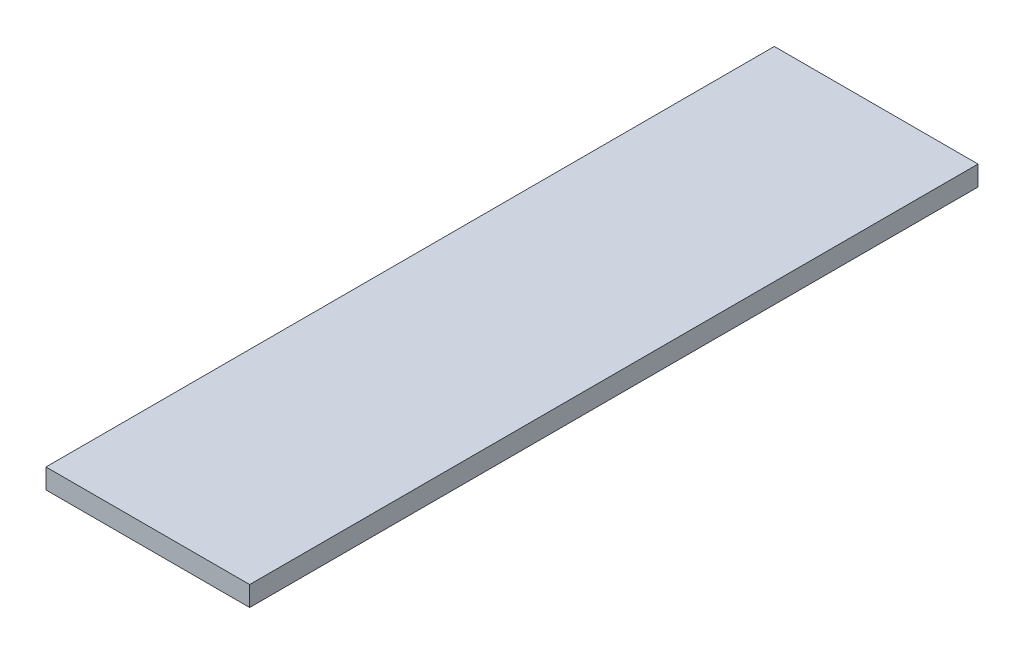
ISO-10303-21;
HEADER;
FILE_DESCRIPTION(('STEP AP214'),'2;1');
FILE_NAME('part.step','',(''),(''),'','','');
FILE_SCHEMA(('AUTOMOTIVE_DESIGN { 1 0 10303 214 1 1 1 1 }'));
ENDSEC;
DATA;
#1=APPLICATION_CONTEXT('core data for automotive mechanical design processes');
#2=APPLICATION_PROTOCOL_DEFINITION('international standard','automotive_design',2000,#1);
#3=PRODUCT_CONTEXT('',#1,'mechanical');
#4=PRODUCT('Part','Part','',(#3));
#5=PRODUCT_RELATED_PRODUCT_CATEGORY('part','',(#4));
#6=PRODUCT_DEFINITION_FORMATION('','',#4);
#7=PRODUCT_DEFINITION_CONTEXT('part definition',#1,'design');
#8=PRODUCT_DEFINITION('design','',#6,#7);
#9=PRODUCT_DEFINITION_SHAPE('','',#8);
#10=(LENGTH_UNIT() NAMED_UNIT(*) SI_UNIT(.MILLI.,.METRE.));
#11=(NAMED_UNIT(*) PLANE_ANGLE_UNIT() SI_UNIT($,.RADIAN.));
#12=(NAMED_UNIT(*) SI_UNIT($,.STERADIAN.) SOLID_ANGLE_UNIT());
#13=UNCERTAINTY_MEASURE_WITH_UNIT(LENGTH_MEASURE(1.E-05),#10,'distance_accuracy_value','');
#14=(GEOMETRIC_REPRESENTATION_CONTEXT(3) GLOBAL_UNCERTAINTY_ASSIGNED_CONTEXT((#13)) GLOBAL_UNIT_ASSIGNED_CONTEXT((#10,
#11,#12)) REPRESENTATION_CONTEXT('',''));
#15=CARTESIAN_POINT('',(0.,0.,0.));
#16=DIRECTION('',(0.,0.,1.));
#17=DIRECTION('',(1.,0.,0.));
#18=AXIS2_PLACEMENT_3D('',#15,#16,#17);
#19=CARTESIAN_POINT('',(-4.99999999999994,-1039.94000000006,-842.878338374161));
#20=DIRECTION('',(1.,0.,0.));
#21=DIRECTION('',(0.,1.,0.));
#22=AXIS2_PLACEMENT_3D('',#19,#20,#21);
#23=PLANE('',#22);
#24=DIRECTION('',(0.,-1.,0.));
#25=VECTOR('',#24,1.);
#26=CARTESIAN_POINT('',(-4.99999999999994,-1039.94000000006,-657.999999999975));
#27=LINE('',#26,#25);
#28=CARTESIAN_POINT('',(-4.99999999999994,-1021.94000000006,-657.999999999975));
#29=VERTEX_POINT('',#28);
#30=CARTESIAN_POINT('',(-4.99999999999994,-1039.94000000006,-657.999999999975));
#31=VERTEX_POINT('',#30);
#32=EDGE_CURVE('E96',#29,#31,#27,.T.);
#33=ORIENTED_EDGE('',*,*,#32,.F.);
#34=DIRECTION('',(0.,0.,1.));
#35=VECTOR('',#34,1.);
#36=CARTESIAN_POINT('',(-4.99999999999994,-1021.94000000006,-842.878338374161));
#37=LINE('',#36,#35);
#38=CARTESIAN_POINT('',(-4.99999999999994,-1021.94000000006,0.));
#39=VERTEX_POINT('',#38);
#40=EDGE_CURVE('E36',#29,#39,#37,.T.);
#41=ORIENTED_EDGE('',*,*,#40,.T.);
#42=DIRECTION('',(0.,1.,0.));
#43=VECTOR('',#42,1.);
#44=CARTESIAN_POINT('',(-4.99999999999994,-1039.94000000006,0.));
#45=LINE('',#44,#43);
#46=CARTESIAN_POINT('',(-4.99999999999994,-1039.94000000006,0.));
#47=VERTEX_POINT('',#46);
#48=EDGE_CURVE('E100',#47,#39,#45,.T.);
#49=ORIENTED_EDGE('',*,*,#48,.F.);
#50=DIRECTION('',(0.,0.,1.));
#51=VECTOR('',#50,1.);
#52=CARTESIAN_POINT('',(-4.99999999999994,-1039.94000000006,-842.878338374161));
#53=LINE('',#52,#51);
#54=EDGE_CURVE('E83',#31,#47,#53,.T.);
#55=ORIENTED_EDGE('',*,*,#54,.F.);
#56=EDGE_LOOP('',(#33,#41,#49,#55));
#57=FACE_BOUND('',#56,.T.);
#58=ADVANCED_FACE('F32',(#57),#23,.T.);
#59=CARTESIAN_POINT('',(-4.99999999999994,-1039.94000000006,-842.878338374161));
#60=DIRECTION('',(0.,-1.,0.));
#61=DIRECTION('',(0.,0.,-1.));
#62=AXIS2_PLACEMENT_3D('',#59,#60,#61);
#63=PLANE('',#62);
#64=DIRECTION('',(-1.,0.,0.));
#65=VECTOR('',#64,1.);
#66=CARTESIAN_POINT('',(-4.99999999999994,-1039.94000000006,-657.999999999975));
#67=LINE('',#66,#65);
#68=CARTESIAN_POINT('',(-189.,-1039.94000000006,-657.999999999975));
#69=VERTEX_POINT('',#68);
#70=EDGE_CURVE('E41',#31,#69,#67,.T.);
#71=ORIENTED_EDGE('',*,*,#70,.F.);
#72=ORIENTED_EDGE('',*,*,#54,.T.);
#73=DIRECTION('',(1.,0.,0.));
#74=VECTOR('',#73,1.);
#75=CARTESIAN_POINT('',(-4.99999999999994,-1039.94000000006,0.));
#76=LINE('',#75,#74);
#77=CARTESIAN_POINT('',(-189.,-1039.94000000006,0.));
#78=VERTEX_POINT('',#77);
#79=EDGE_CURVE('E89',#78,#47,#76,.T.);
#80=ORIENTED_EDGE('',*,*,#79,.F.);
#81=DIRECTION('',(0.,0.,1.));
#82=VECTOR('',#81,1.);
#83=CARTESIAN_POINT('',(-189.,-1039.94000000006,-842.878338374161));
#84=LINE('',#83,#82);
#85=EDGE_CURVE('E77',#69,#78,#84,.T.);
#86=ORIENTED_EDGE('',*,*,#85,.F.);
#87=EDGE_LOOP('',(#71,#72,#80,#86));
#88=FACE_BOUND('',#87,.T.);
#89=ADVANCED_FACE('F92',(#88),#63,.T.);
#90=CARTESIAN_POINT('',(-189.,-1039.94000000006,-842.878338374161));
#91=DIRECTION('',(-1.,0.,0.));
#92=DIRECTION('',(0.,0.,1.));
#93=AXIS2_PLACEMENT_3D('',#90,#91,#92);
#94=PLANE('',#93);
#95=DIRECTION('',(0.,1.,0.));
#96=VECTOR('',#95,1.);
#97=CARTESIAN_POINT('',(-189.,-1039.94000000006,-657.999999999975));
#98=LINE('',#97,#96);
#99=CARTESIAN_POINT('',(-189.,-1021.94000000006,-657.999999999975));
#100=VERTEX_POINT('',#99);
#101=EDGE_CURVE('E11',#69,#100,#98,.T.);
#102=ORIENTED_EDGE('',*,*,#101,.F.);
#103=ORIENTED_EDGE('',*,*,#85,.T.);
#104=DIRECTION('',(0.,-1.,0.));
#105=VECTOR('',#104,1.);
#106=CARTESIAN_POINT('',(-189.,-1039.94000000006,0.));
#107=LINE('',#106,#105);
#108=CARTESIAN_POINT('',(-189.,-1021.94000000006,0.));
#109=VERTEX_POINT('',#108);
#110=EDGE_CURVE('E80',#109,#78,#107,.T.);
#111=ORIENTED_EDGE('',*,*,#110,.F.);
#112=DIRECTION('',(0.,0.,1.));
#113=VECTOR('',#112,1.);
#114=CARTESIAN_POINT('',(-189.,-1021.94000000006,-842.878338374161));
#115=LINE('',#114,#113);
#116=EDGE_CURVE('E54',#100,#109,#115,.T.);
#117=ORIENTED_EDGE('',*,*,#116,.F.);
#118=EDGE_LOOP('',(#102,#103,#111,#117));
#119=FACE_BOUND('',#118,.T.);
#120=ADVANCED_FACE('F79',(#119),#94,.T.);
#121=CARTESIAN_POINT('',(-4.99999999999994,-1021.94000000006,-842.878338374161));
#122=DIRECTION('',(0.,1.,0.));
#123=DIRECTION('',(0.,0.,1.));
#124=AXIS2_PLACEMENT_3D('',#121,#122,#123);
#125=PLANE('',#124);
#126=DIRECTION('',(1.,0.,0.));
#127=VECTOR('',#126,1.);
#128=CARTESIAN_POINT('',(-4.99999999999994,-1021.94000000006,-657.999999999975));
#129=LINE('',#128,#127);
#130=EDGE_CURVE('E93',#100,#29,#129,.T.);
#131=ORIENTED_EDGE('',*,*,#130,.F.);
#132=ORIENTED_EDGE('',*,*,#116,.T.);
#133=DIRECTION('',(-1.,0.,0.));
#134=VECTOR('',#133,1.);
#135=CARTESIAN_POINT('',(-4.99999999999994,-1021.94000000006,0.));
#136=LINE('',#135,#134);
#137=EDGE_CURVE('E90',#39,#109,#136,.T.);
#138=ORIENTED_EDGE('',*,*,#137,.F.);
#139=ORIENTED_EDGE('',*,*,#40,.F.);
#140=EDGE_LOOP('',(#131,#132,#138,#139));
#141=FACE_BOUND('',#140,.T.);
#142=ADVANCED_FACE('F114',(#141),#125,.T.);
#143=CARTESIAN_POINT('',(0.,0.,0.));
#144=DIRECTION('',(0.,0.,1.));
#145=DIRECTION('',(1.,0.,0.));
#146=AXIS2_PLACEMENT_3D('',#143,#144,#145);
#147=PLANE('',#146);
#148=ORIENTED_EDGE('',*,*,#48,.T.);
#149=ORIENTED_EDGE('',*,*,#137,.T.);
#150=ORIENTED_EDGE('',*,*,#110,.T.);
#151=ORIENTED_EDGE('',*,*,#79,.T.);
#152=EDGE_LOOP('',(#148,#149,#150,#151));
#153=FACE_BOUND('',#152,.T.);
#154=ADVANCED_FACE('F88',(#153),#147,.T.);
#155=CARTESIAN_POINT('',(0.,-2156.64,-657.999999999975));
#156=DIRECTION('',(0.,0.,1.));
#157=DIRECTION('',(0.,1.,0.));
#158=AXIS2_PLACEMENT_3D('',#155,#156,#157);
#159=PLANE('',#158);
#160=ORIENTED_EDGE('',*,*,#130,.T.);
#161=ORIENTED_EDGE('',*,*,#32,.T.);
#162=ORIENTED_EDGE('',*,*,#70,.T.);
#163=ORIENTED_EDGE('',*,*,#101,.T.);
#164=EDGE_LOOP('',(#160,#161,#162,#163));
#165=FACE_BOUND('',#164,.T.);
#166=ADVANCED_FACE('F34',(#165),#159,.F.);
#167=CLOSED_SHELL('',(#58,#89,#120,#142,#154,#166));
#168=MANIFOLD_SOLID_BREP('B2',#167);
#169=ADVANCED_BREP_SHAPE_REPRESENTATION('',(#18,#168),#14);
#170=SHAPE_DEFINITION_REPRESENTATION(#9,#169);
ENDSEC;
END-ISO-10303-21;
